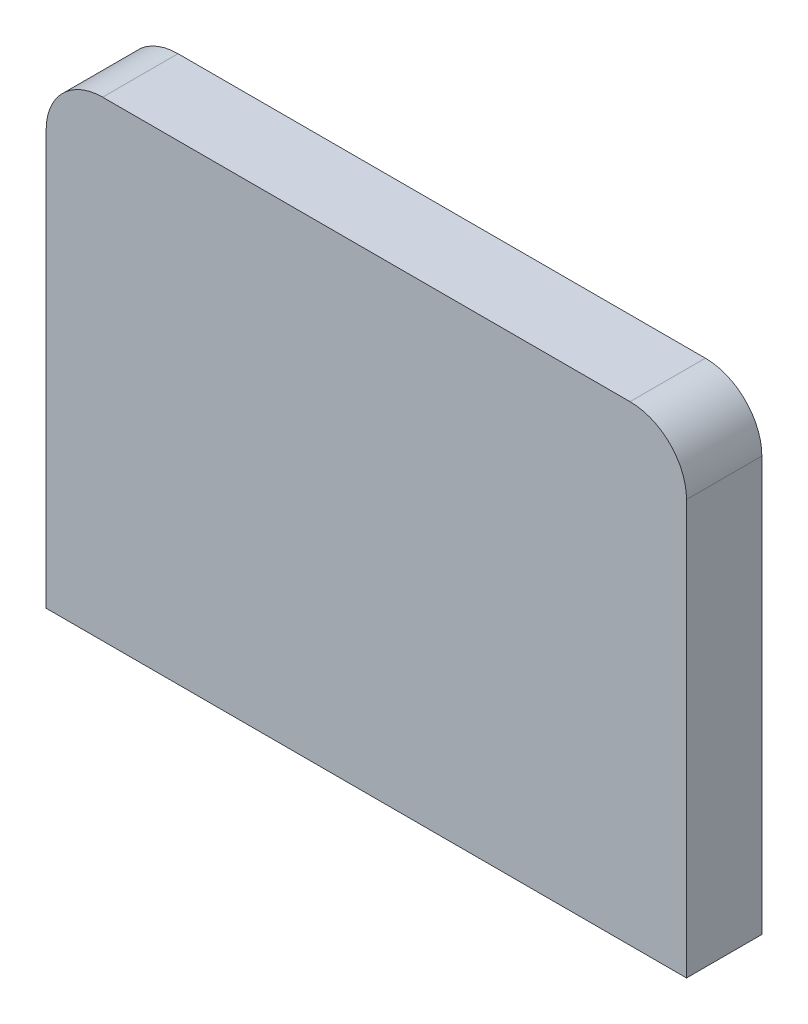
ISO-10303-21;
HEADER;
FILE_DESCRIPTION(('STEP AP214'),'2;1');
FILE_NAME('part.step','',(''),(''),'','','');
FILE_SCHEMA(('AUTOMOTIVE_DESIGN { 1 0 10303 214 1 1 1 1 }'));
ENDSEC;
DATA;
#1=APPLICATION_CONTEXT('core data for automotive mechanical design processes');
#2=APPLICATION_PROTOCOL_DEFINITION('international standard','automotive_design',2000,#1);
#3=PRODUCT_CONTEXT('',#1,'mechanical');
#4=PRODUCT('Part','Part','',(#3));
#5=PRODUCT_RELATED_PRODUCT_CATEGORY('part','',(#4));
#6=PRODUCT_DEFINITION_FORMATION('','',#4);
#7=PRODUCT_DEFINITION_CONTEXT('part definition',#1,'design');
#8=PRODUCT_DEFINITION('design','',#6,#7);
#9=PRODUCT_DEFINITION_SHAPE('','',#8);
#10=(LENGTH_UNIT() NAMED_UNIT(*) SI_UNIT(.MILLI.,.METRE.));
#11=(NAMED_UNIT(*) PLANE_ANGLE_UNIT() SI_UNIT($,.RADIAN.));
#12=(NAMED_UNIT(*) SI_UNIT($,.STERADIAN.) SOLID_ANGLE_UNIT());
#13=UNCERTAINTY_MEASURE_WITH_UNIT(LENGTH_MEASURE(1.E-05),#10,'distance_accuracy_value','');
#14=(GEOMETRIC_REPRESENTATION_CONTEXT(3) GLOBAL_UNCERTAINTY_ASSIGNED_CONTEXT((#13)) GLOBAL_UNIT_ASSIGNED_CONTEXT((#10,
#11,#12)) REPRESENTATION_CONTEXT('',''));
#15=CARTESIAN_POINT('',(0.,0.,0.));
#16=DIRECTION('',(0.,0.,1.));
#17=DIRECTION('',(1.,0.,0.));
#18=AXIS2_PLACEMENT_3D('',#15,#16,#17);
#19=CARTESIAN_POINT('',(-50.6338611990888,31.5502657850382,5.08));
#20=DIRECTION('',(1.,0.,0.));
#21=DIRECTION('',(0.,0.,-1.));
#22=AXIS2_PLACEMENT_3D('',#19,#20,#21);
#23=PLANE('',#22);
#24=DIRECTION('',(0.,-1.,0.));
#25=VECTOR('',#24,1.);
#26=CARTESIAN_POINT('',(-50.6338611990888,31.5502657850382,5.08));
#27=LINE('',#26,#25);
#28=CARTESIAN_POINT('',(-50.6338611990888,27.7402657850382,5.08));
#29=VERTEX_POINT('',#28);
#30=CARTESIAN_POINT('',(-50.6338611990888,-0.199734214961757,5.08));
#31=VERTEX_POINT('',#30);
#32=EDGE_CURVE('E94',#29,#31,#27,.T.);
#33=ORIENTED_EDGE('',*,*,#32,.F.);
#34=DIRECTION('',(0.,0.,-1.));
#35=VECTOR('',#34,1.);
#36=CARTESIAN_POINT('',(-50.6338611990888,27.7402657850382,5.08));
#37=LINE('',#36,#35);
#38=CARTESIAN_POINT('',(-50.6338611990888,27.7402657850382,0.));
#39=VERTEX_POINT('',#38);
#40=EDGE_CURVE('E11',#29,#39,#37,.T.);
#41=ORIENTED_EDGE('',*,*,#40,.T.);
#42=DIRECTION('',(0.,-1.,0.));
#43=VECTOR('',#42,1.);
#44=CARTESIAN_POINT('',(-50.6338611990888,31.5502657850382,0.));
#45=LINE('',#44,#43);
#46=CARTESIAN_POINT('',(-50.6338611990888,-0.199734214961757,0.));
#47=VERTEX_POINT('',#46);
#48=EDGE_CURVE('E113',#39,#47,#45,.T.);
#49=ORIENTED_EDGE('',*,*,#48,.T.);
#50=DIRECTION('',(0.,0.,-1.));
#51=VECTOR('',#50,1.);
#52=CARTESIAN_POINT('',(-50.6338611990888,-0.199734214961757,5.08));
#53=LINE('',#52,#51);
#54=EDGE_CURVE('E107',#31,#47,#53,.T.);
#55=ORIENTED_EDGE('',*,*,#54,.F.);
#56=EDGE_LOOP('',(#33,#41,#49,#55));
#57=FACE_BOUND('',#56,.T.);
#58=ADVANCED_FACE('F41',(#57),#23,.F.);
#59=CARTESIAN_POINT('',(-50.6338611990888,-0.199734214961757,5.08));
#60=DIRECTION('',(0.,1.,0.));
#61=DIRECTION('',(0.,0.,1.));
#62=AXIS2_PLACEMENT_3D('',#59,#60,#61);
#63=PLANE('',#62);
#64=DIRECTION('',(1.,0.,0.));
#65=VECTOR('',#64,1.);
#66=CARTESIAN_POINT('',(-50.6338611990888,-0.199734214961757,0.));
#67=LINE('',#66,#65);
#68=CARTESIAN_POINT('',(-7.45386119908876,-0.199734214961757,0.));
#69=VERTEX_POINT('',#68);
#70=EDGE_CURVE('E146',#47,#69,#67,.T.);
#71=ORIENTED_EDGE('',*,*,#70,.T.);
#72=DIRECTION('',(0.,0.,-1.));
#73=VECTOR('',#72,1.);
#74=CARTESIAN_POINT('',(-7.45386119908876,-0.199734214961757,5.08));
#75=LINE('',#74,#73);
#76=CARTESIAN_POINT('',(-7.45386119908876,-0.199734214961757,5.08));
#77=VERTEX_POINT('',#76);
#78=EDGE_CURVE('E109',#77,#69,#75,.T.);
#79=ORIENTED_EDGE('',*,*,#78,.F.);
#80=DIRECTION('',(1.,0.,0.));
#81=VECTOR('',#80,1.);
#82=CARTESIAN_POINT('',(-50.6338611990888,-0.199734214961757,5.08));
#83=LINE('',#82,#81);
#84=EDGE_CURVE('E97',#31,#77,#83,.T.);
#85=ORIENTED_EDGE('',*,*,#84,.F.);
#86=ORIENTED_EDGE('',*,*,#54,.T.);
#87=EDGE_LOOP('',(#71,#79,#85,#86));
#88=FACE_BOUND('',#87,.T.);
#89=ADVANCED_FACE('F106',(#88),#63,.F.);
#90=CARTESIAN_POINT('',(-7.45386119908877,31.5502657850382,5.08));
#91=DIRECTION('',(-1.,0.,0.));
#92=DIRECTION('',(0.,-1.,0.));
#93=AXIS2_PLACEMENT_3D('',#90,#91,#92);
#94=PLANE('',#93);
#95=DIRECTION('',(0.,1.,0.));
#96=VECTOR('',#95,1.);
#97=CARTESIAN_POINT('',(-7.45386119908877,31.5502657850382,0.));
#98=LINE('',#97,#96);
#99=CARTESIAN_POINT('',(-7.45386119908877,27.7402657850382,0.));
#100=VERTEX_POINT('',#99);
#101=EDGE_CURVE('E144',#69,#100,#98,.T.);
#102=ORIENTED_EDGE('',*,*,#101,.T.);
#103=DIRECTION('',(0.,0.,-1.));
#104=VECTOR('',#103,1.);
#105=CARTESIAN_POINT('',(-7.45386119908877,27.7402657850382,5.08));
#106=LINE('',#105,#104);
#107=CARTESIAN_POINT('',(-7.45386119908877,27.7402657850382,5.08));
#108=VERTEX_POINT('',#107);
#109=EDGE_CURVE('E64',#100,#108,#106,.F.);
#110=ORIENTED_EDGE('',*,*,#109,.T.);
#111=DIRECTION('',(0.,1.,0.));
#112=VECTOR('',#111,1.);
#113=CARTESIAN_POINT('',(-7.45386119908877,31.5502657850382,5.08));
#114=LINE('',#113,#112);
#115=EDGE_CURVE('E110',#77,#108,#114,.T.);
#116=ORIENTED_EDGE('',*,*,#115,.F.);
#117=ORIENTED_EDGE('',*,*,#78,.T.);
#118=EDGE_LOOP('',(#102,#110,#116,#117));
#119=FACE_BOUND('',#118,.T.);
#120=ADVANCED_FACE('F145',(#119),#94,.F.);
#121=CARTESIAN_POINT('',(-50.6338611990888,31.5502657850382,5.08));
#122=DIRECTION('',(0.,-1.,0.));
#123=DIRECTION('',(0.,0.,-1.));
#124=AXIS2_PLACEMENT_3D('',#121,#122,#123);
#125=PLANE('',#124);
#126=DIRECTION('',(-1.,0.,0.));
#127=VECTOR('',#126,1.);
#128=CARTESIAN_POINT('',(-50.6338611990888,31.5502657850382,5.08));
#129=LINE('',#128,#127);
#130=CARTESIAN_POINT('',(-11.2638611990888,31.5502657850382,5.08));
#131=VERTEX_POINT('',#130);
#132=CARTESIAN_POINT('',(-46.8238611990888,31.5502657850382,5.08));
#133=VERTEX_POINT('',#132);
#134=EDGE_CURVE('E119',#131,#133,#129,.T.);
#135=ORIENTED_EDGE('',*,*,#134,.F.);
#136=DIRECTION('',(0.,0.,-1.));
#137=VECTOR('',#136,1.);
#138=CARTESIAN_POINT('',(-11.2638611990888,31.5502657850382,5.08));
#139=LINE('',#138,#137);
#140=CARTESIAN_POINT('',(-11.2638611990888,31.5502657850382,0.));
#141=VERTEX_POINT('',#140);
#142=EDGE_CURVE('E117',#131,#141,#139,.T.);
#143=ORIENTED_EDGE('',*,*,#142,.T.);
#144=DIRECTION('',(-1.,0.,0.));
#145=VECTOR('',#144,1.);
#146=CARTESIAN_POINT('',(-50.6338611990888,31.5502657850382,0.));
#147=LINE('',#146,#145);
#148=CARTESIAN_POINT('',(-46.8238611990888,31.5502657850382,0.));
#149=VERTEX_POINT('',#148);
#150=EDGE_CURVE('E102',#141,#149,#147,.T.);
#151=ORIENTED_EDGE('',*,*,#150,.T.);
#152=DIRECTION('',(0.,0.,-1.));
#153=VECTOR('',#152,1.);
#154=CARTESIAN_POINT('',(-46.8238611990888,31.5502657850382,5.08));
#155=LINE('',#154,#153);
#156=EDGE_CURVE('E115',#149,#133,#155,.F.);
#157=ORIENTED_EDGE('',*,*,#156,.T.);
#158=EDGE_LOOP('',(#135,#143,#151,#157));
#159=FACE_BOUND('',#158,.T.);
#160=ADVANCED_FACE('F135',(#159),#125,.F.);
#161=CARTESIAN_POINT('',(0.,0.,5.08));
#162=DIRECTION('',(0.,0.,1.));
#163=DIRECTION('',(1.,0.,0.));
#164=AXIS2_PLACEMENT_3D('',#161,#162,#163);
#165=PLANE('',#164);
#166=ORIENTED_EDGE('',*,*,#115,.T.);
#167=CARTESIAN_POINT('',(-11.2638611990888,27.7402657850382,5.08));
#168=DIRECTION('',(0.,0.,1.));
#169=DIRECTION('',(1.,0.,0.));
#170=AXIS2_PLACEMENT_3D('',#167,#168,#169);
#171=CIRCLE('',#170,3.81);
#172=EDGE_CURVE('E49',#108,#131,#171,.T.);
#173=ORIENTED_EDGE('',*,*,#172,.T.);
#174=ORIENTED_EDGE('',*,*,#134,.T.);
#175=CARTESIAN_POINT('',(-46.8238611990888,27.7402657850382,5.08));
#176=DIRECTION('',(0.,0.,1.));
#177=DIRECTION('',(1.,0.,0.));
#178=AXIS2_PLACEMENT_3D('',#175,#176,#177);
#179=CIRCLE('',#178,3.81);
#180=EDGE_CURVE('E56',#133,#29,#179,.T.);
#181=ORIENTED_EDGE('',*,*,#180,.T.);
#182=ORIENTED_EDGE('',*,*,#32,.T.);
#183=ORIENTED_EDGE('',*,*,#84,.T.);
#184=EDGE_LOOP('',(#166,#173,#174,#181,#182,#183));
#185=FACE_BOUND('',#184,.T.);
#186=ADVANCED_FACE('F96',(#185),#165,.T.);
#187=CARTESIAN_POINT('',(0.,0.,0.));
#188=DIRECTION('',(0.,0.,1.));
#189=DIRECTION('',(1.,0.,0.));
#190=AXIS2_PLACEMENT_3D('',#187,#188,#189);
#191=PLANE('',#190);
#192=ORIENTED_EDGE('',*,*,#150,.F.);
#193=CARTESIAN_POINT('',(-11.2638611990888,27.7402657850382,0.));
#194=DIRECTION('',(0.,0.,1.));
#195=DIRECTION('',(1.,0.,0.));
#196=AXIS2_PLACEMENT_3D('',#193,#194,#195);
#197=CIRCLE('',#196,3.81);
#198=EDGE_CURVE('E127',#141,#100,#197,.F.);
#199=ORIENTED_EDGE('',*,*,#198,.T.);
#200=ORIENTED_EDGE('',*,*,#101,.F.);
#201=ORIENTED_EDGE('',*,*,#70,.F.);
#202=ORIENTED_EDGE('',*,*,#48,.F.);
#203=CARTESIAN_POINT('',(-46.8238611990888,27.7402657850382,0.));
#204=DIRECTION('',(0.,0.,1.));
#205=DIRECTION('',(1.,0.,0.));
#206=AXIS2_PLACEMENT_3D('',#203,#204,#205);
#207=CIRCLE('',#206,3.81);
#208=EDGE_CURVE('E125',#39,#149,#207,.F.);
#209=ORIENTED_EDGE('',*,*,#208,.T.);
#210=EDGE_LOOP('',(#192,#199,#200,#201,#202,#209));
#211=FACE_BOUND('',#210,.T.);
#212=ADVANCED_FACE('F143',(#211),#191,.F.);
#213=CARTESIAN_POINT('',(-11.2638611990888,27.7402657850382,5.08));
#214=DIRECTION('',(0.,0.,-1.));
#215=DIRECTION('',(-1.,0.,0.));
#216=AXIS2_PLACEMENT_3D('',#213,#214,#215);
#217=CYLINDRICAL_SURFACE('',#216,3.81);
#218=ORIENTED_EDGE('',*,*,#172,.F.);
#219=ORIENTED_EDGE('',*,*,#109,.F.);
#220=ORIENTED_EDGE('',*,*,#198,.F.);
#221=ORIENTED_EDGE('',*,*,#142,.F.);
#222=EDGE_LOOP('',(#218,#219,#220,#221));
#223=FACE_BOUND('',#222,.T.);
#224=ADVANCED_FACE('F140',(#223),#217,.T.);
#225=CARTESIAN_POINT('',(-46.8238611990888,27.7402657850382,5.08));
#226=DIRECTION('',(0.,0.,-1.));
#227=DIRECTION('',(-1.,0.,0.));
#228=AXIS2_PLACEMENT_3D('',#225,#226,#227);
#229=CYLINDRICAL_SURFACE('',#228,3.81);
#230=ORIENTED_EDGE('',*,*,#180,.F.);
#231=ORIENTED_EDGE('',*,*,#156,.F.);
#232=ORIENTED_EDGE('',*,*,#208,.F.);
#233=ORIENTED_EDGE('',*,*,#40,.F.);
#234=EDGE_LOOP('',(#230,#231,#232,#233));
#235=FACE_BOUND('',#234,.T.);
#236=ADVANCED_FACE('F43',(#235),#229,.T.);
#237=CLOSED_SHELL('',(#58,#89,#120,#160,#186,#212,#224,#236));
#238=MANIFOLD_SOLID_BREP('B2',#237);
#239=ADVANCED_BREP_SHAPE_REPRESENTATION('',(#18,#238),#14);
#240=SHAPE_DEFINITION_REPRESENTATION(#9,#239);
ENDSEC;
END-ISO-10303-21;
